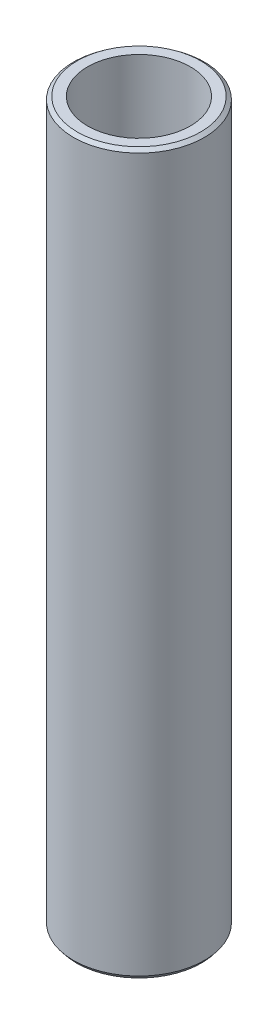
ISO-10303-21;
HEADER;
FILE_DESCRIPTION(('STEP AP214'),'2;1');
FILE_NAME('part.step','',(''),(''),'','','');
FILE_SCHEMA(('AUTOMOTIVE_DESIGN { 1 0 10303 214 1 1 1 1 }'));
ENDSEC;
DATA;
#1=APPLICATION_CONTEXT('core data for automotive mechanical design processes');
#2=APPLICATION_PROTOCOL_DEFINITION('international standard','automotive_design',2000,#1);
#3=PRODUCT_CONTEXT('',#1,'mechanical');
#4=PRODUCT('Part','Part','',(#3));
#5=PRODUCT_RELATED_PRODUCT_CATEGORY('part','',(#4));
#6=PRODUCT_DEFINITION_FORMATION('','',#4);
#7=PRODUCT_DEFINITION_CONTEXT('part definition',#1,'design');
#8=PRODUCT_DEFINITION('design','',#6,#7);
#9=PRODUCT_DEFINITION_SHAPE('','',#8);
#10=(LENGTH_UNIT() NAMED_UNIT(*) SI_UNIT(.MILLI.,.METRE.));
#11=(NAMED_UNIT(*) PLANE_ANGLE_UNIT() SI_UNIT($,.RADIAN.));
#12=(NAMED_UNIT(*) SI_UNIT($,.STERADIAN.) SOLID_ANGLE_UNIT());
#13=UNCERTAINTY_MEASURE_WITH_UNIT(LENGTH_MEASURE(1.E-05),#10,'distance_accuracy_value','');
#14=(GEOMETRIC_REPRESENTATION_CONTEXT(3) GLOBAL_UNCERTAINTY_ASSIGNED_CONTEXT((#13)) GLOBAL_UNIT_ASSIGNED_CONTEXT((#10,
#11,#12)) REPRESENTATION_CONTEXT('',''));
#15=CARTESIAN_POINT('',(0.,0.,0.));
#16=DIRECTION('',(0.,0.,1.));
#17=DIRECTION('',(1.,0.,0.));
#18=AXIS2_PLACEMENT_3D('',#15,#16,#17);
#19=CARTESIAN_POINT('',(0.,412.263819849873,0.));
#20=DIRECTION('',(0.,-1.,0.));
#21=DIRECTION('',(0.,0.,-1.));
#22=AXIS2_PLACEMENT_3D('',#19,#20,#21);
#23=CYLINDRICAL_SURFACE('',#22,37.5);
#24=CARTESIAN_POINT('',(0.,410.6144223668,0.));
#25=DIRECTION('',(0.,1.,0.));
#26=DIRECTION('',(0.,0.,1.));
#27=AXIS2_PLACEMENT_3D('',#24,#25,#26);
#28=CIRCLE('',#27,37.5);
#29=CARTESIAN_POINT('',(0.,410.6144223668,37.5));
#30=VERTEX_POINT('',#29);
#31=EDGE_CURVE('E50',#30,#30,#28,.F.);
#32=ORIENTED_EDGE('',*,*,#31,.T.);
#33=EDGE_LOOP('',(#32));
#34=FACE_BOUND('',#33,.T.);
#35=CARTESIAN_POINT('',(0.,2.13403555736202,0.));
#36=DIRECTION('',(0.,1.,0.));
#37=DIRECTION('',(0.,0.,1.));
#38=AXIS2_PLACEMENT_3D('',#35,#36,#37);
#39=CIRCLE('',#38,37.5);
#40=CARTESIAN_POINT('',(0.,2.13403555736202,37.5));
#41=VERTEX_POINT('',#40);
#42=EDGE_CURVE('E51',#41,#41,#39,.T.);
#43=ORIENTED_EDGE('',*,*,#42,.T.);
#44=EDGE_LOOP('',(#43));
#45=FACE_BOUND('',#44,.T.);
#46=ADVANCED_FACE('F39',(#34,#45),#23,.T.);
#47=CARTESIAN_POINT('',(0.,412.263819849873,0.));
#48=DIRECTION('',(0.,1.,0.));
#49=DIRECTION('',(0.,0.,1.));
#50=AXIS2_PLACEMENT_3D('',#47,#48,#49);
#51=PLANE('',#50);
#52=CARTESIAN_POINT('',(0.,412.263819849873,0.));
#53=DIRECTION('',(0.,1.,0.));
#54=DIRECTION('',(0.,0.,1.));
#55=AXIS2_PLACEMENT_3D('',#52,#53,#54);
#56=CIRCLE('',#55,35.365964442638);
#57=CARTESIAN_POINT('',(0.,412.263819849873,35.365964442638));
#58=VERTEX_POINT('',#57);
#59=EDGE_CURVE('E54',#58,#58,#56,.T.);
#60=ORIENTED_EDGE('',*,*,#59,.T.);
#61=EDGE_LOOP('',(#60));
#62=FACE_BOUND('',#61,.T.);
#63=CARTESIAN_POINT('',(0.,412.263819849873,0.));
#64=DIRECTION('',(0.,1.,0.));
#65=DIRECTION('',(0.,0.,1.));
#66=AXIS2_PLACEMENT_3D('',#63,#64,#65);
#67=CIRCLE('',#66,29.4400520588443);
#68=CARTESIAN_POINT('',(0.,412.263819849873,29.4400520588443));
#69=VERTEX_POINT('',#68);
#70=EDGE_CURVE('E58',#69,#69,#67,.T.);
#71=ORIENTED_EDGE('',*,*,#70,.F.);
#72=EDGE_LOOP('',(#71));
#73=FACE_BOUND('',#72,.T.);
#74=ADVANCED_FACE('F69',(#62,#73),#51,.T.);
#75=CARTESIAN_POINT('',(0.,0.,0.));
#76=DIRECTION('',(0.,1.,0.));
#77=DIRECTION('',(0.,0.,1.));
#78=AXIS2_PLACEMENT_3D('',#75,#76,#77);
#79=PLANE('',#78);
#80=CARTESIAN_POINT('',(0.,0.,0.));
#81=DIRECTION('',(0.,1.,0.));
#82=DIRECTION('',(0.,0.,1.));
#83=AXIS2_PLACEMENT_3D('',#80,#81,#82);
#84=CIRCLE('',#83,35.8506025169272);
#85=CARTESIAN_POINT('',(0.,0.,35.8506025169272));
#86=VERTEX_POINT('',#85);
#87=EDGE_CURVE('E10',#86,#86,#84,.F.);
#88=ORIENTED_EDGE('',*,*,#87,.T.);
#89=EDGE_LOOP('',(#88));
#90=FACE_BOUND('',#89,.T.);
#91=CARTESIAN_POINT('',(0.,0.,0.));
#92=DIRECTION('',(0.,1.,0.));
#93=DIRECTION('',(0.,0.,1.));
#94=AXIS2_PLACEMENT_3D('',#91,#92,#93);
#95=CIRCLE('',#94,29.4400520588443);
#96=CARTESIAN_POINT('',(0.,0.,29.4400520588443));
#97=VERTEX_POINT('',#96);
#98=EDGE_CURVE('E63',#97,#97,#95,.T.);
#99=ORIENTED_EDGE('',*,*,#98,.T.);
#100=EDGE_LOOP('',(#99));
#101=FACE_BOUND('',#100,.T.);
#102=ADVANCED_FACE('F75',(#90,#101),#79,.F.);
#103=CARTESIAN_POINT('',(0.,412.263819849873,0.));
#104=DIRECTION('',(0.,-1.,0.));
#105=DIRECTION('',(0.,0.,-1.));
#106=AXIS2_PLACEMENT_3D('',#103,#104,#105);
#107=CYLINDRICAL_SURFACE('',#106,29.4400520588443);
#108=ORIENTED_EDGE('',*,*,#70,.T.);
#109=EDGE_LOOP('',(#108));
#110=FACE_BOUND('',#109,.T.);
#111=ORIENTED_EDGE('',*,*,#98,.F.);
#112=EDGE_LOOP('',(#111));
#113=FACE_BOUND('',#112,.T.);
#114=ADVANCED_FACE('F70',(#110,#113),#107,.F.);
#115=CARTESIAN_POINT('',(0.,412.263819849873,0.));
#116=DIRECTION('',(0.,-1.,0.));
#117=DIRECTION('',(0.,0.,-1.));
#118=AXIS2_PLACEMENT_3D('',#115,#116,#117);
#119=CONICAL_SURFACE('',#118,35.365964442638,0.912799169659628);
#120=ORIENTED_EDGE('',*,*,#31,.F.);
#121=EDGE_LOOP('',(#120));
#122=FACE_BOUND('',#121,.T.);
#123=ORIENTED_EDGE('',*,*,#59,.F.);
#124=EDGE_LOOP('',(#123));
#125=FACE_BOUND('',#124,.T.);
#126=ADVANCED_FACE('F81',(#122,#125),#119,.T.);
#127=CARTESIAN_POINT('',(0.,2.13403555736202,0.));
#128=DIRECTION('',(0.,1.,0.));
#129=DIRECTION('',(0.,0.,1.));
#130=AXIS2_PLACEMENT_3D('',#127,#128,#129);
#131=CONICAL_SURFACE('',#130,37.5,0.657997157135254);
#132=ORIENTED_EDGE('',*,*,#87,.F.);
#133=EDGE_LOOP('',(#132));
#134=FACE_BOUND('',#133,.T.);
#135=ORIENTED_EDGE('',*,*,#42,.F.);
#136=EDGE_LOOP('',(#135));
#137=FACE_BOUND('',#136,.T.);
#138=ADVANCED_FACE('F45',(#134,#137),#131,.T.);
#139=CLOSED_SHELL('',(#46,#74,#102,#114,#126,#138));
#140=MANIFOLD_SOLID_BREP('B2',#139);
#141=ADVANCED_BREP_SHAPE_REPRESENTATION('',(#18,#140),#14);
#142=SHAPE_DEFINITION_REPRESENTATION(#9,#141);
ENDSEC;
END-ISO-10303-21;
